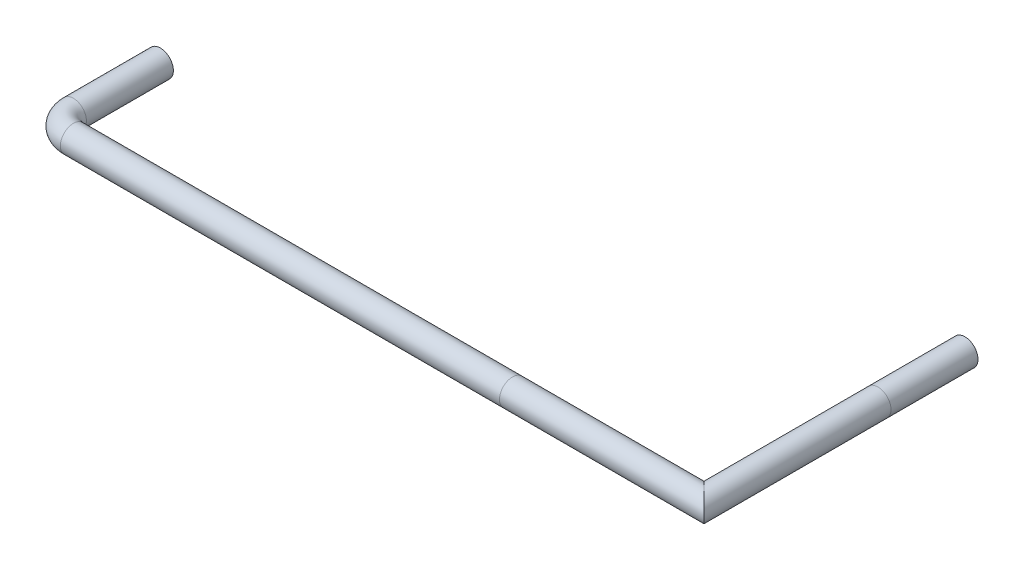
ISO-10303-21;
HEADER;
FILE_DESCRIPTION(('STEP AP214'),'2;1');
FILE_NAME('part.step','',(''),(''),'','','');
FILE_SCHEMA(('AUTOMOTIVE_DESIGN { 1 0 10303 214 1 1 1 1 }'));
ENDSEC;
DATA;
#1=APPLICATION_CONTEXT('core data for automotive mechanical design processes');
#2=APPLICATION_PROTOCOL_DEFINITION('international standard','automotive_design',2000,#1);
#3=PRODUCT_CONTEXT('',#1,'mechanical');
#4=PRODUCT('Part','Part','',(#3));
#5=PRODUCT_RELATED_PRODUCT_CATEGORY('part','',(#4));
#6=PRODUCT_DEFINITION_FORMATION('','',#4);
#7=PRODUCT_DEFINITION_CONTEXT('part definition',#1,'design');
#8=PRODUCT_DEFINITION('design','',#6,#7);
#9=PRODUCT_DEFINITION_SHAPE('','',#8);
#10=(LENGTH_UNIT() NAMED_UNIT(*) SI_UNIT(.MILLI.,.METRE.));
#11=(NAMED_UNIT(*) PLANE_ANGLE_UNIT() SI_UNIT($,.RADIAN.));
#12=(NAMED_UNIT(*) SI_UNIT($,.STERADIAN.) SOLID_ANGLE_UNIT());
#13=UNCERTAINTY_MEASURE_WITH_UNIT(LENGTH_MEASURE(1.E-05),#10,'distance_accuracy_value','');
#14=(GEOMETRIC_REPRESENTATION_CONTEXT(3) GLOBAL_UNCERTAINTY_ASSIGNED_CONTEXT((#13)) GLOBAL_UNIT_ASSIGNED_CONTEXT((#10,
#11,#12)) REPRESENTATION_CONTEXT('',''));
#15=CARTESIAN_POINT('',(0.,0.,0.));
#16=DIRECTION('',(0.,0.,1.));
#17=DIRECTION('',(1.,0.,0.));
#18=AXIS2_PLACEMENT_3D('',#15,#16,#17);
#19=CARTESIAN_POINT('',(-21.1945991215419,0.,-5.00000000000001));
#20=DIRECTION('',(0.,0.,-1.));
#21=DIRECTION('',(-1.,0.,0.));
#22=AXIS2_PLACEMENT_3D('',#19,#20,#21);
#23=PLANE('',#22);
#24=CARTESIAN_POINT('',(-21.1945991215419,0.,-5.00000000000001));
#25=DIRECTION('',(0.,0.,-1.));
#26=DIRECTION('',(-1.,0.,0.));
#27=AXIS2_PLACEMENT_3D('',#24,#25,#26);
#28=CIRCLE('',#27,0.6);
#29=CARTESIAN_POINT('',(-21.7945991215419,0.,-5.00000000000001));
#30=VERTEX_POINT('',#29);
#31=EDGE_CURVE('E48',#30,#30,#28,.T.);
#32=ORIENTED_EDGE('',*,*,#31,.T.);
#33=EDGE_LOOP('',(#32));
#34=FACE_BOUND('',#33,.T.);
#35=ADVANCED_FACE('F31',(#34),#23,.T.);
#36=CARTESIAN_POINT('',(8.80540087845814,0.,-12.));
#37=DIRECTION('',(0.,0.,1.));
#38=DIRECTION('',(1.,0.,0.));
#39=AXIS2_PLACEMENT_3D('',#36,#37,#38);
#40=PLANE('',#39);
#41=CARTESIAN_POINT('',(8.80540087845814,0.,-12.));
#42=DIRECTION('',(0.,0.,1.));
#43=DIRECTION('',(1.,0.,0.));
#44=AXIS2_PLACEMENT_3D('',#41,#42,#43);
#45=CIRCLE('',#44,0.6);
#46=CARTESIAN_POINT('',(9.40540087845814,0.,-12.));
#47=VERTEX_POINT('',#46);
#48=EDGE_CURVE('E10',#47,#47,#45,.T.);
#49=ORIENTED_EDGE('',*,*,#48,.F.);
#50=EDGE_LOOP('',(#49));
#51=FACE_BOUND('',#50,.T.);
#52=ADVANCED_FACE('F64',(#51),#40,.F.);
#53=CARTESIAN_POINT('',(9.56540087845815,0.,0.));
#54=DIRECTION('',(-1.,0.,0.));
#55=DIRECTION('',(0.,0.,1.));
#56=AXIS2_PLACEMENT_3D('',#53,#54,#55);
#57=CYLINDRICAL_SURFACE('',#56,0.6);
#58=CARTESIAN_POINT('',(8.80540087845815,0.,0.));
#59=DIRECTION('',(-0.707106781186547,0.,0.707106781186548));
#60=DIRECTION('',(0.707106781186548,0.,0.707106781186547));
#61=AXIS2_PLACEMENT_3D('',#58,#59,#60);
#62=ELLIPSE('',#61,0.848528137423857,0.6);
#63=CARTESIAN_POINT('',(9.40540087845815,0.,0.600000000000009));
#64=VERTEX_POINT('',#63);
#65=EDGE_CURVE('E43',#64,#64,#62,.F.);
#66=ORIENTED_EDGE('',*,*,#65,.F.);
#67=EDGE_LOOP('',(#66));
#68=FACE_BOUND('',#67,.T.);
#69=CARTESIAN_POINT('',(0.,0.,0.));
#70=DIRECTION('',(-1.,0.,0.));
#71=DIRECTION('',(0.,0.,1.));
#72=AXIS2_PLACEMENT_3D('',#69,#70,#71);
#73=CIRCLE('',#72,0.6);
#74=CARTESIAN_POINT('',(0.,0.,0.600000000000009));
#75=VERTEX_POINT('',#74);
#76=EDGE_CURVE('E34',#75,#75,#73,.T.);
#77=ORIENTED_EDGE('',*,*,#76,.F.);
#78=EDGE_LOOP('',(#77));
#79=FACE_BOUND('',#78,.T.);
#80=ADVANCED_FACE('F62',(#68,#79),#57,.T.);
#81=CARTESIAN_POINT('',(0.,0.,0.));
#82=DIRECTION('',(-1.,0.,0.));
#83=DIRECTION('',(0.,0.,1.));
#84=AXIS2_PLACEMENT_3D('',#81,#82,#83);
#85=CYLINDRICAL_SURFACE('',#84,0.6);
#86=CARTESIAN_POINT('',(-20.1945991215419,0.,0.));
#87=DIRECTION('',(-1.,0.,0.));
#88=DIRECTION('',(0.,0.,1.));
#89=AXIS2_PLACEMENT_3D('',#86,#87,#88);
#90=CIRCLE('',#89,0.6);
#91=CARTESIAN_POINT('',(-20.1945991215418,0.,0.600000000000012));
#92=VERTEX_POINT('',#91);
#93=EDGE_CURVE('E53',#92,#92,#90,.T.);
#94=ORIENTED_EDGE('',*,*,#93,.F.);
#95=EDGE_LOOP('',(#94));
#96=FACE_BOUND('',#95,.T.);
#97=ORIENTED_EDGE('',*,*,#76,.T.);
#98=EDGE_LOOP('',(#97));
#99=FACE_BOUND('',#98,.T.);
#100=ADVANCED_FACE('F60',(#96,#99),#85,.T.);
#101=CARTESIAN_POINT('',(-20.1945991215419,0.,-1.));
#102=DIRECTION('',(0.,-1.,0.));
#103=DIRECTION('',(0.,0.,-1.));
#104=AXIS2_PLACEMENT_3D('',#101,#102,#103);
#105=TOROIDAL_SURFACE('',#104,1.00000000000001,0.6);
#106=CARTESIAN_POINT('',(-21.1945991215419,0.,-1.00000000000001));
#107=DIRECTION('',(0.,0.,-1.));
#108=DIRECTION('',(-1.,0.,0.));
#109=AXIS2_PLACEMENT_3D('',#106,#107,#108);
#110=CIRCLE('',#109,0.6);
#111=CARTESIAN_POINT('',(-21.7945991215419,0.,-1.00000000000001));
#112=VERTEX_POINT('',#111);
#113=EDGE_CURVE('E51',#112,#112,#110,.T.);
#114=CARTESIAN_POINT('',(-20.1945991215419,0.,-1.));
#115=DIRECTION('',(0.,-1.,0.));
#116=DIRECTION('',(0.,0.,-1.));
#117=AXIS2_PLACEMENT_3D('',#114,#115,#116);
#118=CIRCLE('',#117,1.60000000000001);
#119=EDGE_CURVE('',#92,#112,#118,.T.);
#120=ORIENTED_EDGE('',*,*,#93,.T.);
#121=ORIENTED_EDGE('',*,*,#113,.F.);
#122=ORIENTED_EDGE('',*,*,#119,.T.);
#123=ORIENTED_EDGE('',*,*,#119,.F.);
#124=EDGE_LOOP('',(#120,#122,#121,#123));
#125=FACE_BOUND('',#124,.T.);
#126=ADVANCED_FACE('F71',(#125),#105,.T.);
#127=CARTESIAN_POINT('',(-21.1945991215419,0.,-1.00000000000001));
#128=DIRECTION('',(0.,0.,-1.));
#129=DIRECTION('',(-1.,0.,0.));
#130=AXIS2_PLACEMENT_3D('',#127,#128,#129);
#131=CYLINDRICAL_SURFACE('',#130,0.6);
#132=ORIENTED_EDGE('',*,*,#31,.F.);
#133=EDGE_LOOP('',(#132));
#134=FACE_BOUND('',#133,.T.);
#135=ORIENTED_EDGE('',*,*,#113,.T.);
#136=EDGE_LOOP('',(#135));
#137=FACE_BOUND('',#136,.T.);
#138=ADVANCED_FACE('F84',(#134,#137),#131,.T.);
#139=CARTESIAN_POINT('',(8.80540087845814,0.,-12.));
#140=DIRECTION('',(0.,0.,1.));
#141=DIRECTION('',(1.,0.,0.));
#142=AXIS2_PLACEMENT_3D('',#139,#140,#141);
#143=CYLINDRICAL_SURFACE('',#142,0.6);
#144=CARTESIAN_POINT('',(8.80540087845814,0.,-8.));
#145=DIRECTION('',(0.,0.,1.));
#146=DIRECTION('',(1.,0.,0.));
#147=AXIS2_PLACEMENT_3D('',#144,#145,#146);
#148=CIRCLE('',#147,0.6);
#149=CARTESIAN_POINT('',(9.40540087845813,0.,-8.));
#150=VERTEX_POINT('',#149);
#151=EDGE_CURVE('E38',#150,#150,#148,.T.);
#152=ORIENTED_EDGE('',*,*,#151,.F.);
#153=EDGE_LOOP('',(#152));
#154=FACE_BOUND('',#153,.T.);
#155=ORIENTED_EDGE('',*,*,#48,.T.);
#156=EDGE_LOOP('',(#155));
#157=FACE_BOUND('',#156,.T.);
#158=ADVANCED_FACE('F78',(#154,#157),#143,.T.);
#159=CARTESIAN_POINT('',(8.80540087845814,0.,-8.));
#160=DIRECTION('',(0.,0.,1.));
#161=DIRECTION('',(1.,0.,0.));
#162=AXIS2_PLACEMENT_3D('',#159,#160,#161);
#163=CYLINDRICAL_SURFACE('',#162,0.6);
#164=ORIENTED_EDGE('',*,*,#151,.T.);
#165=EDGE_LOOP('',(#164));
#166=FACE_BOUND('',#165,.T.);
#167=ORIENTED_EDGE('',*,*,#65,.T.);
#168=EDGE_LOOP('',(#167));
#169=FACE_BOUND('',#168,.T.);
#170=ADVANCED_FACE('F76',(#166,#169),#163,.T.);
#171=CLOSED_SHELL('',(#35,#52,#80,#100,#126,#138,#158,#170));
#172=MANIFOLD_SOLID_BREP('B2',#171);
#173=ADVANCED_BREP_SHAPE_REPRESENTATION('',(#18,#172),#14);
#174=SHAPE_DEFINITION_REPRESENTATION(#9,#173);
ENDSEC;
END-ISO-10303-21;
